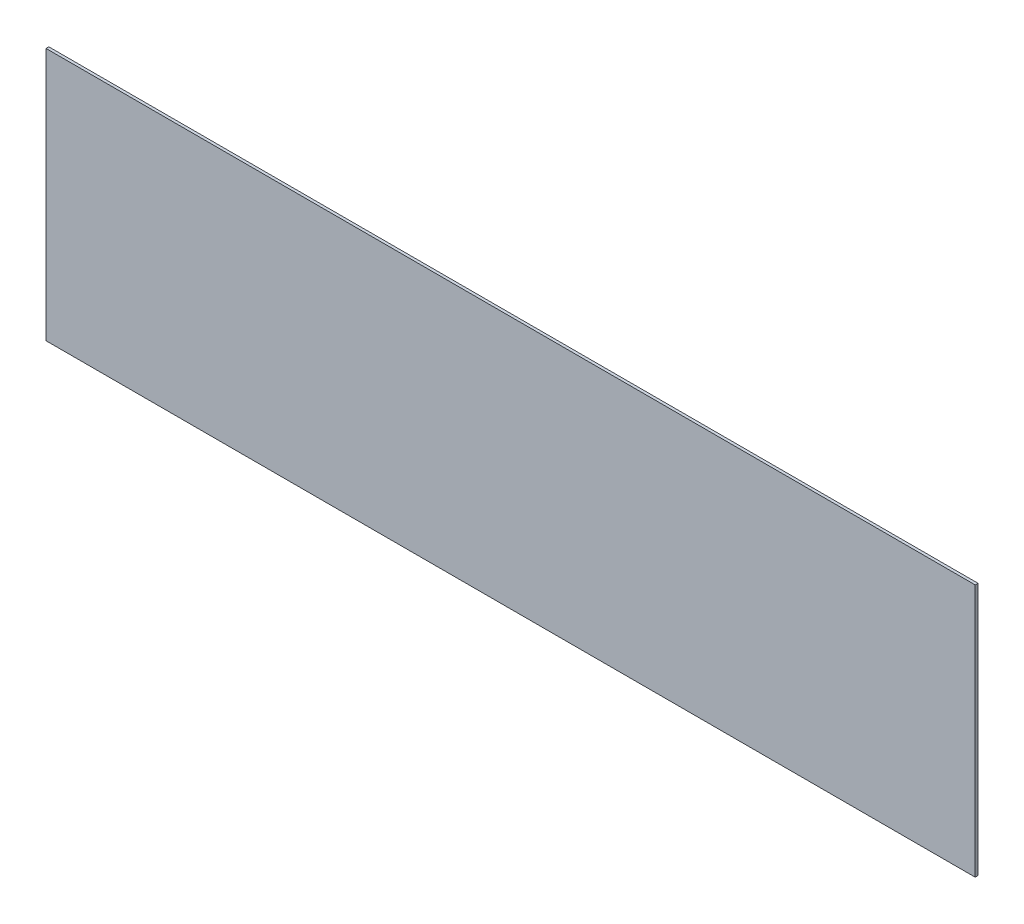
ISO-10303-21;
HEADER;
FILE_DESCRIPTION(('STEP AP214'),'2;1');
FILE_NAME('part.step','',(''),(''),'','','');
FILE_SCHEMA(('AUTOMOTIVE_DESIGN { 1 0 10303 214 1 1 1 1 }'));
ENDSEC;
DATA;
#1=APPLICATION_CONTEXT('core data for automotive mechanical design processes');
#2=APPLICATION_PROTOCOL_DEFINITION('international standard','automotive_design',2000,#1);
#3=PRODUCT_CONTEXT('',#1,'mechanical');
#4=PRODUCT('Part','Part','',(#3));
#5=PRODUCT_RELATED_PRODUCT_CATEGORY('part','',(#4));
#6=PRODUCT_DEFINITION_FORMATION('','',#4);
#7=PRODUCT_DEFINITION_CONTEXT('part definition',#1,'design');
#8=PRODUCT_DEFINITION('design','',#6,#7);
#9=PRODUCT_DEFINITION_SHAPE('','',#8);
#10=(LENGTH_UNIT() NAMED_UNIT(*) SI_UNIT(.MILLI.,.METRE.));
#11=(NAMED_UNIT(*) PLANE_ANGLE_UNIT() SI_UNIT($,.RADIAN.));
#12=(NAMED_UNIT(*) SI_UNIT($,.STERADIAN.) SOLID_ANGLE_UNIT());
#13=UNCERTAINTY_MEASURE_WITH_UNIT(LENGTH_MEASURE(1.E-05),#10,'distance_accuracy_value','');
#14=(GEOMETRIC_REPRESENTATION_CONTEXT(3) GLOBAL_UNCERTAINTY_ASSIGNED_CONTEXT((#13)) GLOBAL_UNIT_ASSIGNED_CONTEXT((#10,
#11,#12)) REPRESENTATION_CONTEXT('',''));
#15=CARTESIAN_POINT('',(0.,0.,0.));
#16=DIRECTION('',(0.,0.,1.));
#17=DIRECTION('',(1.,0.,0.));
#18=AXIS2_PLACEMENT_3D('',#15,#16,#17);
#19=CARTESIAN_POINT('',(495.5,-135.,3.));
#20=DIRECTION('',(-1.,0.,0.));
#21=DIRECTION('',(0.,0.,1.));
#22=AXIS2_PLACEMENT_3D('',#19,#20,#21);
#23=PLANE('',#22);
#24=DIRECTION('',(0.,1.,0.));
#25=VECTOR('',#24,1.);
#26=CARTESIAN_POINT('',(495.5,-135.,0.));
#27=LINE('',#26,#25);
#28=CARTESIAN_POINT('',(495.5,-135.,0.));
#29=VERTEX_POINT('',#28);
#30=CARTESIAN_POINT('',(495.5,135.,0.));
#31=VERTEX_POINT('',#30);
#32=EDGE_CURVE('E95',#29,#31,#27,.T.);
#33=ORIENTED_EDGE('',*,*,#32,.T.);
#34=DIRECTION('',(0.,0.,-1.));
#35=VECTOR('',#34,1.);
#36=CARTESIAN_POINT('',(495.5,135.,3.));
#37=LINE('',#36,#35);
#38=CARTESIAN_POINT('',(495.5,135.,3.));
#39=VERTEX_POINT('',#38);
#40=EDGE_CURVE('E11',#39,#31,#37,.T.);
#41=ORIENTED_EDGE('',*,*,#40,.F.);
#42=DIRECTION('',(0.,1.,0.));
#43=VECTOR('',#42,1.);
#44=CARTESIAN_POINT('',(495.5,-135.,3.));
#45=LINE('',#44,#43);
#46=CARTESIAN_POINT('',(495.5,-135.,3.));
#47=VERTEX_POINT('',#46);
#48=EDGE_CURVE('E83',#47,#39,#45,.T.);
#49=ORIENTED_EDGE('',*,*,#48,.F.);
#50=DIRECTION('',(0.,0.,-1.));
#51=VECTOR('',#50,1.);
#52=CARTESIAN_POINT('',(495.5,-135.,3.));
#53=LINE('',#52,#51);
#54=EDGE_CURVE('E91',#47,#29,#53,.T.);
#55=ORIENTED_EDGE('',*,*,#54,.T.);
#56=EDGE_LOOP('',(#33,#41,#49,#55));
#57=FACE_BOUND('',#56,.T.);
#58=ADVANCED_FACE('F32',(#57),#23,.F.);
#59=CARTESIAN_POINT('',(-495.5,135.,3.));
#60=DIRECTION('',(0.,-1.,0.));
#61=DIRECTION('',(0.,0.,-1.));
#62=AXIS2_PLACEMENT_3D('',#59,#60,#61);
#63=PLANE('',#62);
#64=DIRECTION('',(-1.,0.,0.));
#65=VECTOR('',#64,1.);
#66=CARTESIAN_POINT('',(-495.5,135.,0.));
#67=LINE('',#66,#65);
#68=CARTESIAN_POINT('',(-495.5,135.,0.));
#69=VERTEX_POINT('',#68);
#70=EDGE_CURVE('E87',#31,#69,#67,.T.);
#71=ORIENTED_EDGE('',*,*,#70,.T.);
#72=DIRECTION('',(0.,0.,-1.));
#73=VECTOR('',#72,1.);
#74=CARTESIAN_POINT('',(-495.5,135.,3.));
#75=LINE('',#74,#73);
#76=CARTESIAN_POINT('',(-495.5,135.,3.));
#77=VERTEX_POINT('',#76);
#78=EDGE_CURVE('E40',#77,#69,#75,.T.);
#79=ORIENTED_EDGE('',*,*,#78,.F.);
#80=DIRECTION('',(-1.,0.,0.));
#81=VECTOR('',#80,1.);
#82=CARTESIAN_POINT('',(-495.5,135.,3.));
#83=LINE('',#82,#81);
#84=EDGE_CURVE('E78',#39,#77,#83,.T.);
#85=ORIENTED_EDGE('',*,*,#84,.F.);
#86=ORIENTED_EDGE('',*,*,#40,.T.);
#87=EDGE_LOOP('',(#71,#79,#85,#86));
#88=FACE_BOUND('',#87,.T.);
#89=ADVANCED_FACE('F86',(#88),#63,.F.);
#90=CARTESIAN_POINT('',(-495.5,-135.,3.));
#91=DIRECTION('',(1.,0.,0.));
#92=DIRECTION('',(0.,0.,-1.));
#93=AXIS2_PLACEMENT_3D('',#90,#91,#92);
#94=PLANE('',#93);
#95=DIRECTION('',(0.,-1.,0.));
#96=VECTOR('',#95,1.);
#97=CARTESIAN_POINT('',(-495.5,-135.,0.));
#98=LINE('',#97,#96);
#99=CARTESIAN_POINT('',(-495.5,-135.,0.));
#100=VERTEX_POINT('',#99);
#101=EDGE_CURVE('E65',#69,#100,#98,.T.);
#102=ORIENTED_EDGE('',*,*,#101,.T.);
#103=DIRECTION('',(0.,0.,-1.));
#104=VECTOR('',#103,1.);
#105=CARTESIAN_POINT('',(-495.5,-135.,3.));
#106=LINE('',#105,#104);
#107=CARTESIAN_POINT('',(-495.5,-135.,3.));
#108=VERTEX_POINT('',#107);
#109=EDGE_CURVE('E88',#108,#100,#106,.T.);
#110=ORIENTED_EDGE('',*,*,#109,.F.);
#111=DIRECTION('',(0.,-1.,0.));
#112=VECTOR('',#111,1.);
#113=CARTESIAN_POINT('',(-495.5,-135.,3.));
#114=LINE('',#113,#112);
#115=EDGE_CURVE('E81',#77,#108,#114,.T.);
#116=ORIENTED_EDGE('',*,*,#115,.F.);
#117=ORIENTED_EDGE('',*,*,#78,.T.);
#118=EDGE_LOOP('',(#102,#110,#116,#117));
#119=FACE_BOUND('',#118,.T.);
#120=ADVANCED_FACE('F89',(#119),#94,.F.);
#121=CARTESIAN_POINT('',(-495.5,-135.,3.));
#122=DIRECTION('',(0.,1.,0.));
#123=DIRECTION('',(0.,0.,1.));
#124=AXIS2_PLACEMENT_3D('',#121,#122,#123);
#125=PLANE('',#124);
#126=DIRECTION('',(1.,0.,0.));
#127=VECTOR('',#126,1.);
#128=CARTESIAN_POINT('',(-495.5,-135.,0.));
#129=LINE('',#128,#127);
#130=EDGE_CURVE('E71',#100,#29,#129,.T.);
#131=ORIENTED_EDGE('',*,*,#130,.T.);
#132=ORIENTED_EDGE('',*,*,#54,.F.);
#133=DIRECTION('',(1.,0.,0.));
#134=VECTOR('',#133,1.);
#135=CARTESIAN_POINT('',(-495.5,-135.,3.));
#136=LINE('',#135,#134);
#137=EDGE_CURVE('E48',#108,#47,#136,.T.);
#138=ORIENTED_EDGE('',*,*,#137,.F.);
#139=ORIENTED_EDGE('',*,*,#109,.T.);
#140=EDGE_LOOP('',(#131,#132,#138,#139));
#141=FACE_BOUND('',#140,.T.);
#142=ADVANCED_FACE('F102',(#141),#125,.F.);
#143=CARTESIAN_POINT('',(0.,0.,3.));
#144=DIRECTION('',(0.,0.,-1.));
#145=DIRECTION('',(-1.,0.,0.));
#146=AXIS2_PLACEMENT_3D('',#143,#144,#145);
#147=PLANE('',#146);
#148=ORIENTED_EDGE('',*,*,#48,.T.);
#149=ORIENTED_EDGE('',*,*,#84,.T.);
#150=ORIENTED_EDGE('',*,*,#115,.T.);
#151=ORIENTED_EDGE('',*,*,#137,.T.);
#152=EDGE_LOOP('',(#148,#149,#150,#151));
#153=FACE_BOUND('',#152,.T.);
#154=ADVANCED_FACE('F79',(#153),#147,.F.);
#155=CARTESIAN_POINT('',(0.,0.,0.));
#156=DIRECTION('',(0.,0.,-1.));
#157=DIRECTION('',(-1.,0.,0.));
#158=AXIS2_PLACEMENT_3D('',#155,#156,#157);
#159=PLANE('',#158);
#160=ORIENTED_EDGE('',*,*,#32,.F.);
#161=ORIENTED_EDGE('',*,*,#130,.F.);
#162=ORIENTED_EDGE('',*,*,#101,.F.);
#163=ORIENTED_EDGE('',*,*,#70,.F.);
#164=EDGE_LOOP('',(#160,#161,#162,#163));
#165=FACE_BOUND('',#164,.T.);
#166=ADVANCED_FACE('F105',(#165),#159,.T.);
#167=CLOSED_SHELL('',(#58,#89,#120,#142,#154,#166));
#168=MANIFOLD_SOLID_BREP('B2',#167);
#169=ADVANCED_BREP_SHAPE_REPRESENTATION('',(#18,#168),#14);
#170=SHAPE_DEFINITION_REPRESENTATION(#9,#169);
ENDSEC;
END-ISO-10303-21;
